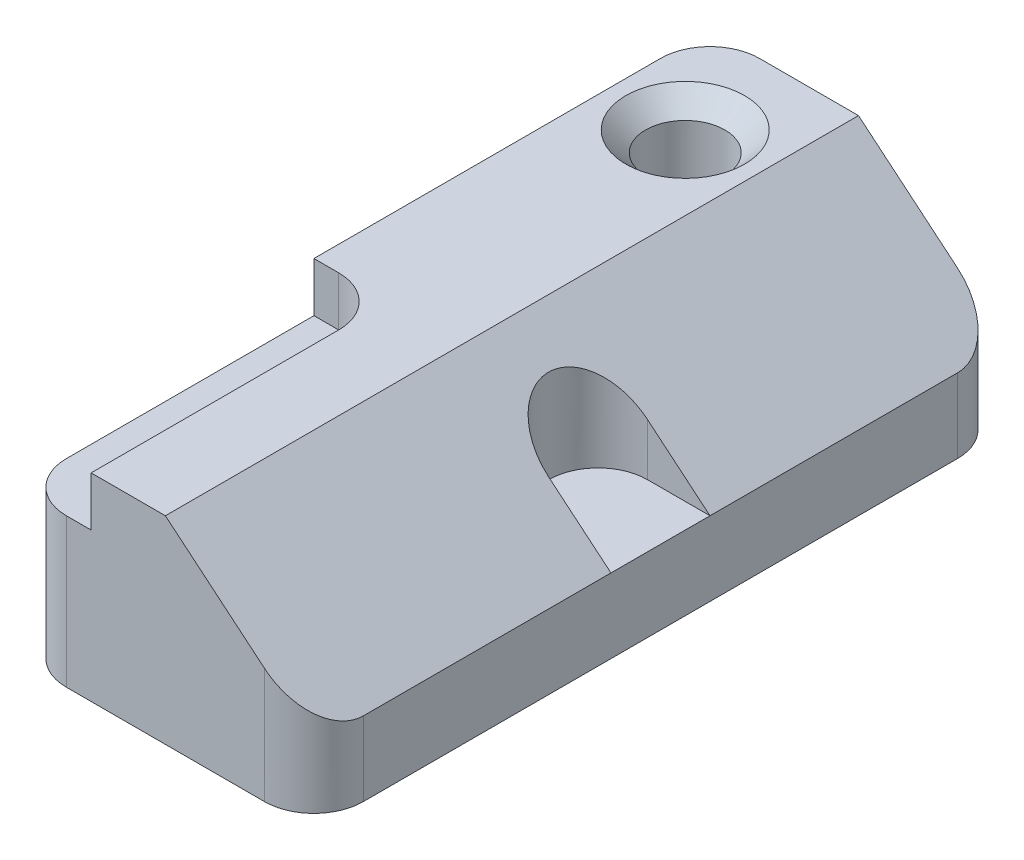
ISO-10303-21;
HEADER;
FILE_DESCRIPTION(('STEP AP214'),'2;1');
FILE_NAME('part.step','',(''),(''),'','','');
FILE_SCHEMA(('AUTOMOTIVE_DESIGN { 1 0 10303 214 1 1 1 1 }'));
ENDSEC;
DATA;
#1=APPLICATION_CONTEXT('core data for automotive mechanical design processes');
#2=APPLICATION_PROTOCOL_DEFINITION('international standard','automotive_design',2000,#1);
#3=PRODUCT_CONTEXT('',#1,'mechanical');
#4=PRODUCT('Part','Part','',(#3));
#5=PRODUCT_RELATED_PRODUCT_CATEGORY('part','',(#4));
#6=PRODUCT_DEFINITION_FORMATION('','',#4);
#7=PRODUCT_DEFINITION_CONTEXT('part definition',#1,'design');
#8=PRODUCT_DEFINITION('design','',#6,#7);
#9=PRODUCT_DEFINITION_SHAPE('','',#8);
#10=(LENGTH_UNIT() NAMED_UNIT(*) SI_UNIT(.MILLI.,.METRE.));
#11=(NAMED_UNIT(*) PLANE_ANGLE_UNIT() SI_UNIT($,.RADIAN.));
#12=(NAMED_UNIT(*) SI_UNIT($,.STERADIAN.) SOLID_ANGLE_UNIT());
#13=UNCERTAINTY_MEASURE_WITH_UNIT(LENGTH_MEASURE(1.E-05),#10,'distance_accuracy_value','');
#14=(GEOMETRIC_REPRESENTATION_CONTEXT(3) GLOBAL_UNCERTAINTY_ASSIGNED_CONTEXT((#13)) GLOBAL_UNIT_ASSIGNED_CONTEXT((#10,
#11,#12)) REPRESENTATION_CONTEXT('',''));
#15=CARTESIAN_POINT('',(0.,0.,0.));
#16=DIRECTION('',(0.,0.,1.));
#17=DIRECTION('',(1.,0.,0.));
#18=AXIS2_PLACEMENT_3D('',#15,#16,#17);
#19=CARTESIAN_POINT('',(0.,50.8,177.8));
#20=DIRECTION('',(0.,-1.,0.));
#21=DIRECTION('',(0.,0.,-1.));
#22=AXIS2_PLACEMENT_3D('',#19,#20,#21);
#23=PLANE('',#22);
#24=CARTESIAN_POINT('',(19.05,50.8,25.4));
#25=DIRECTION('',(0.,-1.,0.));
#26=DIRECTION('',(0.,0.,-1.));
#27=AXIS2_PLACEMENT_3D('',#24,#25,#26);
#28=CIRCLE('',#27,15.24);
#29=CARTESIAN_POINT('',(19.05,50.8,10.16));
#30=VERTEX_POINT('',#29);
#31=EDGE_CURVE('E266',#30,#30,#28,.T.);
#32=ORIENTED_EDGE('',*,*,#31,.T.);
#33=EDGE_LOOP('',(#32));
#34=FACE_BOUND('',#33,.T.);
#35=DIRECTION('',(-1.,0.,0.));
#36=VECTOR('',#35,1.);
#37=CARTESIAN_POINT('',(0.,50.8,0.));
#38=LINE('',#37,#36);
#39=CARTESIAN_POINT('',(38.1,50.8,0.));
#40=VERTEX_POINT('',#39);
#41=CARTESIAN_POINT('',(12.7,50.8,0.));
#42=VERTEX_POINT('',#41);
#43=EDGE_CURVE('E226',#40,#42,#38,.T.);
#44=ORIENTED_EDGE('',*,*,#43,.T.);
#45=CARTESIAN_POINT('',(12.7,50.8,12.7));
#46=DIRECTION('',(0.,-1.,0.));
#47=DIRECTION('',(0.,0.,-1.));
#48=AXIS2_PLACEMENT_3D('',#45,#46,#47);
#49=CIRCLE('',#48,12.7);
#50=CARTESIAN_POINT('',(0.,50.8,12.7));
#51=VERTEX_POINT('',#50);
#52=EDGE_CURVE('E317',#42,#51,#49,.F.);
#53=ORIENTED_EDGE('',*,*,#52,.T.);
#54=DIRECTION('',(0.,0.,-1.));
#55=VECTOR('',#54,1.);
#56=CARTESIAN_POINT('',(0.,50.8,177.8));
#57=LINE('',#56,#55);
#58=CARTESIAN_POINT('',(0.,50.8,101.6));
#59=VERTEX_POINT('',#58);
#60=EDGE_CURVE('E246',#59,#51,#57,.T.);
#61=ORIENTED_EDGE('',*,*,#60,.F.);
#62=DIRECTION('',(1.,0.,0.));
#63=VECTOR('',#62,1.);
#64=CARTESIAN_POINT('',(0.,50.8,101.6));
#65=LINE('',#64,#63);
#66=CARTESIAN_POINT('',(6.35,50.8,101.6));
#67=VERTEX_POINT('',#66);
#68=EDGE_CURVE('E186',#59,#67,#65,.T.);
#69=ORIENTED_EDGE('',*,*,#68,.T.);
#70=CARTESIAN_POINT('',(6.35,50.8,114.3));
#71=DIRECTION('',(0.,-1.,0.));
#72=DIRECTION('',(0.,0.,-1.));
#73=AXIS2_PLACEMENT_3D('',#70,#71,#72);
#74=CIRCLE('',#73,12.7);
#75=CARTESIAN_POINT('',(19.05,50.8,114.3));
#76=VERTEX_POINT('',#75);
#77=EDGE_CURVE('E280',#67,#76,#74,.T.);
#78=ORIENTED_EDGE('',*,*,#77,.T.);
#79=DIRECTION('',(0.,0.,-1.));
#80=VECTOR('',#79,1.);
#81=CARTESIAN_POINT('',(19.05,50.8,177.8));
#82=LINE('',#81,#80);
#83=CARTESIAN_POINT('',(19.05,50.8,177.8));
#84=VERTEX_POINT('',#83);
#85=EDGE_CURVE('E193',#84,#76,#82,.T.);
#86=ORIENTED_EDGE('',*,*,#85,.F.);
#87=DIRECTION('',(-1.,0.,0.));
#88=VECTOR('',#87,1.);
#89=CARTESIAN_POINT('',(0.,50.8,177.8));
#90=LINE('',#89,#88);
#91=CARTESIAN_POINT('',(38.1,50.8,177.8));
#92=VERTEX_POINT('',#91);
#93=EDGE_CURVE('E229',#92,#84,#90,.T.);
#94=ORIENTED_EDGE('',*,*,#93,.F.);
#95=DIRECTION('',(0.,0.,-1.));
#96=VECTOR('',#95,1.);
#97=CARTESIAN_POINT('',(38.1,50.8,177.8));
#98=LINE('',#97,#96);
#99=EDGE_CURVE('E250',#92,#40,#98,.T.);
#100=ORIENTED_EDGE('',*,*,#99,.T.);
#101=EDGE_LOOP('',(#44,#53,#61,#69,#78,#86,#94,#100));
#102=FACE_BOUND('',#101,.T.);
#103=ADVANCED_FACE('F39',(#34,#102),#23,.F.);
#104=CARTESIAN_POINT('',(0.,0.,177.8));
#105=DIRECTION('',(1.,0.,0.));
#106=DIRECTION('',(0.,0.,-1.));
#107=AXIS2_PLACEMENT_3D('',#104,#105,#106);
#108=PLANE('',#107);
#109=ORIENTED_EDGE('',*,*,#60,.T.);
#110=DIRECTION('',(0.,-1.,0.));
#111=VECTOR('',#110,1.);
#112=CARTESIAN_POINT('',(0.,0.,12.7));
#113=LINE('',#112,#111);
#114=CARTESIAN_POINT('',(0.,0.,12.7));
#115=VERTEX_POINT('',#114);
#116=EDGE_CURVE('E295',#51,#115,#113,.T.);
#117=ORIENTED_EDGE('',*,*,#116,.T.);
#118=DIRECTION('',(0.,0.,-1.));
#119=VECTOR('',#118,1.);
#120=CARTESIAN_POINT('',(0.,0.,177.8));
#121=LINE('',#120,#119);
#122=CARTESIAN_POINT('',(0.,0.,165.1));
#123=VERTEX_POINT('',#122);
#124=EDGE_CURVE('E233',#123,#115,#121,.T.);
#125=ORIENTED_EDGE('',*,*,#124,.F.);
#126=DIRECTION('',(0.,-1.,0.));
#127=VECTOR('',#126,1.);
#128=CARTESIAN_POINT('',(0.,0.,165.1));
#129=LINE('',#128,#127);
#130=CARTESIAN_POINT('',(0.,38.1,165.1));
#131=VERTEX_POINT('',#130);
#132=EDGE_CURVE('E292',#123,#131,#129,.F.);
#133=ORIENTED_EDGE('',*,*,#132,.T.);
#134=DIRECTION('',(0.,0.,-1.));
#135=VECTOR('',#134,1.);
#136=CARTESIAN_POINT('',(0.,38.1,177.8));
#137=LINE('',#136,#135);
#138=CARTESIAN_POINT('',(0.,38.1,101.6));
#139=VERTEX_POINT('',#138);
#140=EDGE_CURVE('E200',#131,#139,#137,.T.);
#141=ORIENTED_EDGE('',*,*,#140,.T.);
#142=DIRECTION('',(0.,1.,0.));
#143=VECTOR('',#142,1.);
#144=CARTESIAN_POINT('',(0.,38.1,101.6));
#145=LINE('',#144,#143);
#146=EDGE_CURVE('E203',#139,#59,#145,.T.);
#147=ORIENTED_EDGE('',*,*,#146,.T.);
#148=EDGE_LOOP('',(#109,#117,#125,#133,#141,#147));
#149=FACE_BOUND('',#148,.T.);
#150=ADVANCED_FACE('F370',(#149),#108,.F.);
#151=CARTESIAN_POINT('',(76.2,0.,177.8));
#152=DIRECTION('',(0.,1.,0.));
#153=DIRECTION('',(-1.,0.,0.));
#154=AXIS2_PLACEMENT_3D('',#151,#152,#153);
#155=PLANE('',#154);
#156=CARTESIAN_POINT('',(19.05,0.,25.4));
#157=DIRECTION('',(0.,1.,0.));
#158=DIRECTION('',(0.,0.,1.));
#159=AXIS2_PLACEMENT_3D('',#156,#157,#158);
#160=CIRCLE('',#159,10.16);
#161=CARTESIAN_POINT('',(19.05,0.,35.56));
#162=VERTEX_POINT('',#161);
#163=EDGE_CURVE('E216',#162,#162,#160,.T.);
#164=ORIENTED_EDGE('',*,*,#163,.T.);
#165=EDGE_LOOP('',(#164));
#166=FACE_BOUND('',#165,.T.);
#167=ORIENTED_EDGE('',*,*,#124,.T.);
#168=CARTESIAN_POINT('',(12.7,0.,12.7));
#169=DIRECTION('',(0.,1.,0.));
#170=DIRECTION('',(-1.,0.,0.));
#171=AXIS2_PLACEMENT_3D('',#168,#169,#170);
#172=CIRCLE('',#171,12.7);
#173=CARTESIAN_POINT('',(12.7,0.,0.));
#174=VERTEX_POINT('',#173);
#175=EDGE_CURVE('E308',#115,#174,#172,.F.);
#176=ORIENTED_EDGE('',*,*,#175,.T.);
#177=DIRECTION('',(1.,0.,0.));
#178=VECTOR('',#177,1.);
#179=CARTESIAN_POINT('',(76.2,0.,0.));
#180=LINE('',#179,#178);
#181=CARTESIAN_POINT('',(63.5,0.,0.));
#182=VERTEX_POINT('',#181);
#183=EDGE_CURVE('E220',#174,#182,#180,.T.);
#184=ORIENTED_EDGE('',*,*,#183,.T.);
#185=CARTESIAN_POINT('',(63.5,0.,12.7));
#186=DIRECTION('',(0.,1.,0.));
#187=DIRECTION('',(-1.,0.,0.));
#188=AXIS2_PLACEMENT_3D('',#185,#186,#187);
#189=CIRCLE('',#188,12.7);
#190=CARTESIAN_POINT('',(76.2,0.,12.7));
#191=VERTEX_POINT('',#190);
#192=EDGE_CURVE('E305',#182,#191,#189,.F.);
#193=ORIENTED_EDGE('',*,*,#192,.T.);
#194=DIRECTION('',(0.,0.,-1.));
#195=VECTOR('',#194,1.);
#196=CARTESIAN_POINT('',(76.2,0.,177.8));
#197=LINE('',#196,#195);
#198=CARTESIAN_POINT('',(76.2,0.,165.1));
#199=VERTEX_POINT('',#198);
#200=EDGE_CURVE('E258',#199,#191,#197,.T.);
#201=ORIENTED_EDGE('',*,*,#200,.F.);
#202=CARTESIAN_POINT('',(63.5,0.,165.1));
#203=DIRECTION('',(0.,1.,0.));
#204=DIRECTION('',(-1.,0.,0.));
#205=AXIS2_PLACEMENT_3D('',#202,#203,#204);
#206=CIRCLE('',#205,12.7);
#207=CARTESIAN_POINT('',(63.5,0.,177.8));
#208=VERTEX_POINT('',#207);
#209=EDGE_CURVE('E302',#199,#208,#206,.F.);
#210=ORIENTED_EDGE('',*,*,#209,.T.);
#211=DIRECTION('',(1.,0.,0.));
#212=VECTOR('',#211,1.);
#213=CARTESIAN_POINT('',(76.2,0.,177.8));
#214=LINE('',#213,#212);
#215=CARTESIAN_POINT('',(12.7,0.,177.8));
#216=VERTEX_POINT('',#215);
#217=EDGE_CURVE('E221',#216,#208,#214,.T.);
#218=ORIENTED_EDGE('',*,*,#217,.F.);
#219=CARTESIAN_POINT('',(12.7,0.,165.1));
#220=DIRECTION('',(0.,1.,0.));
#221=DIRECTION('',(-1.,0.,0.));
#222=AXIS2_PLACEMENT_3D('',#219,#220,#221);
#223=CIRCLE('',#222,12.7);
#224=EDGE_CURVE('E299',#216,#123,#223,.F.);
#225=ORIENTED_EDGE('',*,*,#224,.T.);
#226=EDGE_LOOP('',(#167,#176,#184,#193,#201,#210,#218,#225));
#227=FACE_BOUND('',#226,.T.);
#228=ADVANCED_FACE('F377',(#166,#227),#155,.F.);
#229=CARTESIAN_POINT('',(76.2,19.05,177.8));
#230=DIRECTION('',(-1.,0.,0.));
#231=DIRECTION('',(0.,0.,1.));
#232=AXIS2_PLACEMENT_3D('',#229,#230,#231);
#233=PLANE('',#232);
#234=ORIENTED_EDGE('',*,*,#200,.T.);
#235=DIRECTION('',(0.,1.,0.));
#236=VECTOR('',#235,1.);
#237=CARTESIAN_POINT('',(76.2,19.05,12.7));
#238=LINE('',#237,#236);
#239=CARTESIAN_POINT('',(76.2,19.05,12.7));
#240=VERTEX_POINT('',#239);
#241=EDGE_CURVE('E323',#191,#240,#238,.T.);
#242=ORIENTED_EDGE('',*,*,#241,.T.);
#243=DIRECTION('',(0.,0.,-1.));
#244=VECTOR('',#243,1.);
#245=CARTESIAN_POINT('',(76.2,19.05,177.8));
#246=LINE('',#245,#244);
#247=CARTESIAN_POINT('',(76.2,19.05,76.2));
#248=VERTEX_POINT('',#247);
#249=EDGE_CURVE('E254',#248,#240,#246,.T.);
#250=ORIENTED_EDGE('',*,*,#249,.F.);
#251=DIRECTION('',(0.,0.,1.));
#252=VECTOR('',#251,1.);
#253=CARTESIAN_POINT('',(76.2,19.05,76.2));
#254=LINE('',#253,#252);
#255=CARTESIAN_POINT('',(76.2,19.05,101.6));
#256=VERTEX_POINT('',#255);
#257=EDGE_CURVE('E174',#248,#256,#254,.T.);
#258=ORIENTED_EDGE('',*,*,#257,.T.);
#259=CARTESIAN_POINT('',(76.2,19.05,165.1));
#260=VERTEX_POINT('',#259);
#261=EDGE_CURVE('E255',#260,#256,#246,.T.);
#262=ORIENTED_EDGE('',*,*,#261,.F.);
#263=DIRECTION('',(0.,1.,0.));
#264=VECTOR('',#263,1.);
#265=CARTESIAN_POINT('',(76.2,19.05,165.1));
#266=LINE('',#265,#264);
#267=EDGE_CURVE('E320',#260,#199,#266,.F.);
#268=ORIENTED_EDGE('',*,*,#267,.T.);
#269=EDGE_LOOP('',(#234,#242,#250,#258,#262,#268));
#270=FACE_BOUND('',#269,.T.);
#271=ADVANCED_FACE('F387',(#270),#233,.F.);
#272=CARTESIAN_POINT('',(38.1,50.8,177.8));
#273=DIRECTION('',(-0.64018439966448,-0.768221279597376,0.));
#274=DIRECTION('',(0.768221279597376,-0.64018439966448,0.));
#275=AXIS2_PLACEMENT_3D('',#272,#273,#274);
#276=PLANE('',#275);
#277=ORIENTED_EDGE('',*,*,#249,.T.);
#278=CARTESIAN_POINT('',(63.5,29.6333333333333,12.7));
#279=DIRECTION('',(-0.64018439966448,-0.768221279597376,0.));
#280=DIRECTION('',(0.768221279597376,-0.64018439966448,0.));
#281=AXIS2_PLACEMENT_3D('',#278,#279,#280);
#282=ELLIPSE('',#281,16.5316951473358,12.7);
#283=CARTESIAN_POINT('',(63.5,29.6333333333333,0.));
#284=VERTEX_POINT('',#283);
#285=EDGE_CURVE('E329',#240,#284,#282,.F.);
#286=ORIENTED_EDGE('',*,*,#285,.T.);
#287=DIRECTION('',(-0.768221279597376,0.64018439966448,0.));
#288=VECTOR('',#287,1.);
#289=CARTESIAN_POINT('',(38.1,50.8,0.));
#290=LINE('',#289,#288);
#291=EDGE_CURVE('E237',#284,#40,#290,.T.);
#292=ORIENTED_EDGE('',*,*,#291,.T.);
#293=ORIENTED_EDGE('',*,*,#99,.F.);
#294=DIRECTION('',(-0.768221279597376,0.64018439966448,0.));
#295=VECTOR('',#294,1.);
#296=CARTESIAN_POINT('',(38.1,50.8,177.8));
#297=LINE('',#296,#295);
#298=CARTESIAN_POINT('',(63.5,29.6333333333333,177.8));
#299=VERTEX_POINT('',#298);
#300=EDGE_CURVE('E225',#299,#92,#297,.T.);
#301=ORIENTED_EDGE('',*,*,#300,.F.);
#302=CARTESIAN_POINT('',(63.5,29.6333333333333,165.1));
#303=DIRECTION('',(-0.64018439966448,-0.768221279597376,0.));
#304=DIRECTION('',(-0.768221279597376,0.64018439966448,0.));
#305=AXIS2_PLACEMENT_3D('',#302,#303,#304);
#306=ELLIPSE('',#305,16.5316951473358,12.7);
#307=EDGE_CURVE('E61',#299,#260,#306,.F.);
#308=ORIENTED_EDGE('',*,*,#307,.T.);
#309=ORIENTED_EDGE('',*,*,#261,.T.);
#310=DIRECTION('',(0.768221279597376,-0.64018439966448,0.));
#311=VECTOR('',#310,1.);
#312=CARTESIAN_POINT('',(38.1,50.8,101.6));
#313=LINE('',#312,#311);
#314=CARTESIAN_POINT('',(60.198,32.385,101.6));
#315=VERTEX_POINT('',#314);
#316=EDGE_CURVE('E286',#315,#256,#313,.T.);
#317=ORIENTED_EDGE('',*,*,#316,.F.);
#318=CARTESIAN_POINT('',(60.198,32.385,88.9));
#319=DIRECTION('',(-0.64018439966448,-0.768221279597376,0.));
#320=DIRECTION('',(-0.768221279597376,0.64018439966448,0.));
#321=AXIS2_PLACEMENT_3D('',#318,#319,#320);
#322=ELLIPSE('',#321,16.5316951473358,12.7);
#323=CARTESIAN_POINT('',(60.198,32.385,76.2));
#324=VERTEX_POINT('',#323);
#325=EDGE_CURVE('E283',#324,#315,#322,.F.);
#326=ORIENTED_EDGE('',*,*,#325,.F.);
#327=DIRECTION('',(0.768221279597376,-0.64018439966448,0.));
#328=VECTOR('',#327,1.);
#329=CARTESIAN_POINT('',(38.1,50.8,76.2));
#330=LINE('',#329,#328);
#331=EDGE_CURVE('E172',#324,#248,#330,.T.);
#332=ORIENTED_EDGE('',*,*,#331,.T.);
#333=EDGE_LOOP('',(#277,#286,#292,#293,#301,#308,#309,#317,#326,#332));
#334=FACE_BOUND('',#333,.T.);
#335=ADVANCED_FACE('F344',(#334),#276,.F.);
#336=CARTESIAN_POINT('',(0.,0.,177.8));
#337=DIRECTION('',(0.,0.,-1.));
#338=DIRECTION('',(-1.,0.,0.));
#339=AXIS2_PLACEMENT_3D('',#336,#337,#338);
#340=PLANE('',#339);
#341=ORIENTED_EDGE('',*,*,#217,.T.);
#342=DIRECTION('',(0.,1.,0.));
#343=VECTOR('',#342,1.);
#344=CARTESIAN_POINT('',(63.5,0.,177.8));
#345=LINE('',#344,#343);
#346=EDGE_CURVE('E48',#208,#299,#345,.T.);
#347=ORIENTED_EDGE('',*,*,#346,.T.);
#348=ORIENTED_EDGE('',*,*,#300,.T.);
#349=ORIENTED_EDGE('',*,*,#93,.T.);
#350=DIRECTION('',(0.,1.,0.));
#351=VECTOR('',#350,1.);
#352=CARTESIAN_POINT('',(19.05,38.1,177.8));
#353=LINE('',#352,#351);
#354=CARTESIAN_POINT('',(19.05,38.1,177.8));
#355=VERTEX_POINT('',#354);
#356=EDGE_CURVE('E213',#355,#84,#353,.T.);
#357=ORIENTED_EDGE('',*,*,#356,.F.);
#358=DIRECTION('',(1.,0.,0.));
#359=VECTOR('',#358,1.);
#360=CARTESIAN_POINT('',(0.,38.1,177.8));
#361=LINE('',#360,#359);
#362=CARTESIAN_POINT('',(12.7,38.1,177.8));
#363=VERTEX_POINT('',#362);
#364=EDGE_CURVE('E197',#363,#355,#361,.T.);
#365=ORIENTED_EDGE('',*,*,#364,.F.);
#366=DIRECTION('',(0.,-1.,0.));
#367=VECTOR('',#366,1.);
#368=CARTESIAN_POINT('',(12.7,0.,177.8));
#369=LINE('',#368,#367);
#370=EDGE_CURVE('E332',#363,#216,#369,.T.);
#371=ORIENTED_EDGE('',*,*,#370,.T.);
#372=EDGE_LOOP('',(#341,#347,#348,#349,#357,#365,#371));
#373=FACE_BOUND('',#372,.T.);
#374=ADVANCED_FACE('F338',(#373),#340,.F.);
#375=CARTESIAN_POINT('',(0.,0.,0.));
#376=DIRECTION('',(0.,0.,-1.));
#377=DIRECTION('',(-1.,0.,0.));
#378=AXIS2_PLACEMENT_3D('',#375,#376,#377);
#379=PLANE('',#378);
#380=ORIENTED_EDGE('',*,*,#183,.F.);
#381=DIRECTION('',(0.,-1.,0.));
#382=VECTOR('',#381,1.);
#383=CARTESIAN_POINT('',(12.7,50.8,0.));
#384=LINE('',#383,#382);
#385=EDGE_CURVE('E314',#174,#42,#384,.F.);
#386=ORIENTED_EDGE('',*,*,#385,.T.);
#387=ORIENTED_EDGE('',*,*,#43,.F.);
#388=ORIENTED_EDGE('',*,*,#291,.F.);
#389=DIRECTION('',(0.,1.,0.));
#390=VECTOR('',#389,1.);
#391=CARTESIAN_POINT('',(63.5,0.,0.));
#392=LINE('',#391,#390);
#393=EDGE_CURVE('E311',#284,#182,#392,.F.);
#394=ORIENTED_EDGE('',*,*,#393,.T.);
#395=EDGE_LOOP('',(#380,#386,#387,#388,#394));
#396=FACE_BOUND('',#395,.T.);
#397=ADVANCED_FACE('F380',(#396),#379,.T.);
#398=CARTESIAN_POINT('',(19.05,0.,25.4));
#399=DIRECTION('',(0.,1.,0.));
#400=DIRECTION('',(0.,0.,1.));
#401=AXIS2_PLACEMENT_3D('',#398,#399,#400);
#402=CYLINDRICAL_SURFACE('',#401,10.16);
#403=CARTESIAN_POINT('',(19.05,45.7200000000001,25.4));
#404=DIRECTION('',(0.,-1.,0.));
#405=DIRECTION('',(0.,0.,-1.));
#406=AXIS2_PLACEMENT_3D('',#403,#404,#405);
#407=CIRCLE('',#406,10.16);
#408=CARTESIAN_POINT('',(19.05,45.7200000000001,15.24));
#409=VERTEX_POINT('',#408);
#410=EDGE_CURVE('E262',#409,#409,#407,.F.);
#411=ORIENTED_EDGE('',*,*,#410,.T.);
#412=EDGE_LOOP('',(#411));
#413=FACE_BOUND('',#412,.T.);
#414=ORIENTED_EDGE('',*,*,#163,.F.);
#415=EDGE_LOOP('',(#414));
#416=FACE_BOUND('',#415,.T.);
#417=ADVANCED_FACE('F415',(#413,#416),#402,.F.);
#418=CARTESIAN_POINT('',(19.05,45.7200000000001,25.4));
#419=DIRECTION('',(0.,1.,0.));
#420=DIRECTION('',(0.,0.,1.));
#421=AXIS2_PLACEMENT_3D('',#418,#419,#420);
#422=CONICAL_SURFACE('',#421,10.16,0.785398163397452);
#423=ORIENTED_EDGE('',*,*,#31,.F.);
#424=EDGE_LOOP('',(#423));
#425=FACE_BOUND('',#424,.T.);
#426=ORIENTED_EDGE('',*,*,#410,.F.);
#427=EDGE_LOOP('',(#426));
#428=FACE_BOUND('',#427,.T.);
#429=ADVANCED_FACE('F412',(#425,#428),#422,.F.);
#430=CARTESIAN_POINT('',(0.,38.1,101.6));
#431=DIRECTION('',(0.,0.,1.));
#432=DIRECTION('',(1.,0.,0.));
#433=AXIS2_PLACEMENT_3D('',#430,#431,#432);
#434=PLANE('',#433);
#435=DIRECTION('',(1.,0.,0.));
#436=VECTOR('',#435,1.);
#437=CARTESIAN_POINT('',(0.,38.1,101.6));
#438=LINE('',#437,#436);
#439=CARTESIAN_POINT('',(6.35,38.1,101.6));
#440=VERTEX_POINT('',#439);
#441=EDGE_CURVE('E188',#139,#440,#438,.T.);
#442=ORIENTED_EDGE('',*,*,#441,.T.);
#443=DIRECTION('',(0.,1.,0.));
#444=VECTOR('',#443,1.);
#445=CARTESIAN_POINT('',(6.35,38.1,101.6));
#446=LINE('',#445,#444);
#447=EDGE_CURVE('E270',#440,#67,#446,.T.);
#448=ORIENTED_EDGE('',*,*,#447,.T.);
#449=ORIENTED_EDGE('',*,*,#68,.F.);
#450=ORIENTED_EDGE('',*,*,#146,.F.);
#451=EDGE_LOOP('',(#442,#448,#449,#450));
#452=FACE_BOUND('',#451,.T.);
#453=ADVANCED_FACE('F364',(#452),#434,.T.);
#454=CARTESIAN_POINT('',(19.05,38.1,177.8));
#455=DIRECTION('',(1.,0.,0.));
#456=DIRECTION('',(0.,0.,-1.));
#457=AXIS2_PLACEMENT_3D('',#454,#455,#456);
#458=PLANE('',#457);
#459=ORIENTED_EDGE('',*,*,#85,.T.);
#460=DIRECTION('',(0.,1.,0.));
#461=VECTOR('',#460,1.);
#462=CARTESIAN_POINT('',(19.05,38.1,114.3));
#463=LINE('',#462,#461);
#464=CARTESIAN_POINT('',(19.05,38.1,114.3));
#465=VERTEX_POINT('',#464);
#466=EDGE_CURVE('E274',#76,#465,#463,.F.);
#467=ORIENTED_EDGE('',*,*,#466,.T.);
#468=DIRECTION('',(0.,0.,-1.));
#469=VECTOR('',#468,1.);
#470=CARTESIAN_POINT('',(19.05,38.1,177.8));
#471=LINE('',#470,#469);
#472=EDGE_CURVE('E192',#355,#465,#471,.T.);
#473=ORIENTED_EDGE('',*,*,#472,.F.);
#474=ORIENTED_EDGE('',*,*,#356,.T.);
#475=EDGE_LOOP('',(#459,#467,#473,#474));
#476=FACE_BOUND('',#475,.T.);
#477=ADVANCED_FACE('F355',(#476),#458,.F.);
#478=CARTESIAN_POINT('',(0.,38.1,0.));
#479=DIRECTION('',(0.,1.,0.));
#480=DIRECTION('',(0.,0.,1.));
#481=AXIS2_PLACEMENT_3D('',#478,#479,#480);
#482=PLANE('',#481);
#483=ORIENTED_EDGE('',*,*,#140,.F.);
#484=CARTESIAN_POINT('',(12.7,38.1,165.1));
#485=DIRECTION('',(0.,1.,0.));
#486=DIRECTION('',(0.,0.,1.));
#487=AXIS2_PLACEMENT_3D('',#484,#485,#486);
#488=CIRCLE('',#487,12.7);
#489=EDGE_CURVE('E11',#131,#363,#488,.T.);
#490=ORIENTED_EDGE('',*,*,#489,.T.);
#491=ORIENTED_EDGE('',*,*,#364,.T.);
#492=ORIENTED_EDGE('',*,*,#472,.T.);
#493=CARTESIAN_POINT('',(6.35,38.1,114.3));
#494=DIRECTION('',(0.,1.,0.));
#495=DIRECTION('',(0.,0.,1.));
#496=AXIS2_PLACEMENT_3D('',#493,#494,#495);
#497=CIRCLE('',#496,12.7);
#498=EDGE_CURVE('E277',#465,#440,#497,.T.);
#499=ORIENTED_EDGE('',*,*,#498,.T.);
#500=ORIENTED_EDGE('',*,*,#441,.F.);
#501=EDGE_LOOP('',(#483,#490,#491,#492,#499,#500));
#502=FACE_BOUND('',#501,.T.);
#503=ADVANCED_FACE('F358',(#502),#482,.T.);
#504=CARTESIAN_POINT('',(6.35,38.1,114.3));
#505=DIRECTION('',(0.,1.,0.));
#506=DIRECTION('',(0.,0.,1.));
#507=AXIS2_PLACEMENT_3D('',#504,#505,#506);
#508=CYLINDRICAL_SURFACE('',#507,12.7);
#509=ORIENTED_EDGE('',*,*,#498,.F.);
#510=ORIENTED_EDGE('',*,*,#466,.F.);
#511=ORIENTED_EDGE('',*,*,#77,.F.);
#512=ORIENTED_EDGE('',*,*,#447,.F.);
#513=EDGE_LOOP('',(#509,#510,#511,#512));
#514=FACE_BOUND('',#513,.T.);
#515=ADVANCED_FACE('F362',(#514),#508,.F.);
#516=CARTESIAN_POINT('',(76.2,19.05,76.2));
#517=DIRECTION('',(0.,0.,-1.));
#518=DIRECTION('',(-1.,0.,0.));
#519=AXIS2_PLACEMENT_3D('',#516,#517,#518);
#520=PLANE('',#519);
#521=DIRECTION('',(0.,1.,0.));
#522=VECTOR('',#521,1.);
#523=CARTESIAN_POINT('',(60.198,19.05,76.2));
#524=LINE('',#523,#522);
#525=CARTESIAN_POINT('',(60.198,19.05,76.2));
#526=VERTEX_POINT('',#525);
#527=EDGE_CURVE('E157',#526,#324,#524,.T.);
#528=ORIENTED_EDGE('',*,*,#527,.F.);
#529=DIRECTION('',(-1.,0.,0.));
#530=VECTOR('',#529,1.);
#531=CARTESIAN_POINT('',(76.2,19.05,76.2));
#532=LINE('',#531,#530);
#533=EDGE_CURVE('E166',#248,#526,#532,.T.);
#534=ORIENTED_EDGE('',*,*,#533,.F.);
#535=ORIENTED_EDGE('',*,*,#331,.F.);
#536=EDGE_LOOP('',(#528,#534,#535));
#537=FACE_BOUND('',#536,.T.);
#538=ADVANCED_FACE('F170',(#537),#520,.F.);
#539=CARTESIAN_POINT('',(76.2,19.05,101.6));
#540=DIRECTION('',(0.,0.,-1.));
#541=DIRECTION('',(-1.,0.,0.));
#542=AXIS2_PLACEMENT_3D('',#539,#540,#541);
#543=PLANE('',#542);
#544=ORIENTED_EDGE('',*,*,#316,.T.);
#545=DIRECTION('',(-1.,0.,0.));
#546=VECTOR('',#545,1.);
#547=CARTESIAN_POINT('',(76.2,19.05,101.6));
#548=LINE('',#547,#546);
#549=CARTESIAN_POINT('',(60.198,19.05,101.6));
#550=VERTEX_POINT('',#549);
#551=EDGE_CURVE('E165',#256,#550,#548,.T.);
#552=ORIENTED_EDGE('',*,*,#551,.T.);
#553=DIRECTION('',(0.,1.,0.));
#554=VECTOR('',#553,1.);
#555=CARTESIAN_POINT('',(60.198,19.05,101.6));
#556=LINE('',#555,#554);
#557=EDGE_CURVE('E160',#550,#315,#556,.T.);
#558=ORIENTED_EDGE('',*,*,#557,.T.);
#559=EDGE_LOOP('',(#544,#552,#558));
#560=FACE_BOUND('',#559,.T.);
#561=ADVANCED_FACE('F458',(#560),#543,.T.);
#562=CARTESIAN_POINT('',(60.198,19.05,88.9));
#563=DIRECTION('',(0.,1.,0.));
#564=DIRECTION('',(0.,0.,1.));
#565=AXIS2_PLACEMENT_3D('',#562,#563,#564);
#566=CYLINDRICAL_SURFACE('',#565,12.7);
#567=ORIENTED_EDGE('',*,*,#325,.T.);
#568=ORIENTED_EDGE('',*,*,#557,.F.);
#569=CARTESIAN_POINT('',(60.198,19.05,88.9));
#570=DIRECTION('',(0.,-1.,0.));
#571=DIRECTION('',(0.,0.,-1.));
#572=AXIS2_PLACEMENT_3D('',#569,#570,#571);
#573=CIRCLE('',#572,12.7);
#574=EDGE_CURVE('E154',#550,#526,#573,.T.);
#575=ORIENTED_EDGE('',*,*,#574,.T.);
#576=ORIENTED_EDGE('',*,*,#527,.T.);
#577=EDGE_LOOP('',(#567,#568,#575,#576));
#578=FACE_BOUND('',#577,.T.);
#579=ADVANCED_FACE('F156',(#578),#566,.F.);
#580=CARTESIAN_POINT('',(60.198,19.05,88.9));
#581=DIRECTION('',(0.,-1.,0.));
#582=DIRECTION('',(0.,0.,-1.));
#583=AXIS2_PLACEMENT_3D('',#580,#581,#582);
#584=PLANE('',#583);
#585=ORIENTED_EDGE('',*,*,#533,.T.);
#586=ORIENTED_EDGE('',*,*,#574,.F.);
#587=ORIENTED_EDGE('',*,*,#551,.F.);
#588=ORIENTED_EDGE('',*,*,#257,.F.);
#589=EDGE_LOOP('',(#585,#586,#587,#588));
#590=FACE_BOUND('',#589,.T.);
#591=ADVANCED_FACE('F176',(#590),#584,.F.);
#592=CARTESIAN_POINT('',(12.7,0.,12.7));
#593=DIRECTION('',(0.,1.,0.));
#594=DIRECTION('',(0.,0.,1.));
#595=AXIS2_PLACEMENT_3D('',#592,#593,#594);
#596=CYLINDRICAL_SURFACE('',#595,12.7);
#597=ORIENTED_EDGE('',*,*,#52,.F.);
#598=ORIENTED_EDGE('',*,*,#385,.F.);
#599=ORIENTED_EDGE('',*,*,#175,.F.);
#600=ORIENTED_EDGE('',*,*,#116,.F.);
#601=EDGE_LOOP('',(#597,#598,#599,#600));
#602=FACE_BOUND('',#601,.T.);
#603=ADVANCED_FACE('F373',(#602),#596,.T.);
#604=CARTESIAN_POINT('',(63.5,19.05,12.7));
#605=DIRECTION('',(0.,-1.,0.));
#606=DIRECTION('',(0.,0.,-1.));
#607=AXIS2_PLACEMENT_3D('',#604,#605,#606);
#608=CYLINDRICAL_SURFACE('',#607,12.7);
#609=ORIENTED_EDGE('',*,*,#192,.F.);
#610=ORIENTED_EDGE('',*,*,#393,.F.);
#611=ORIENTED_EDGE('',*,*,#285,.F.);
#612=ORIENTED_EDGE('',*,*,#241,.F.);
#613=EDGE_LOOP('',(#609,#610,#611,#612));
#614=FACE_BOUND('',#613,.T.);
#615=ADVANCED_FACE('F383',(#614),#608,.T.);
#616=CARTESIAN_POINT('',(63.5,0.,165.1));
#617=DIRECTION('',(0.,1.,0.));
#618=DIRECTION('',(0.,0.,1.));
#619=AXIS2_PLACEMENT_3D('',#616,#617,#618);
#620=CYLINDRICAL_SURFACE('',#619,12.7);
#621=ORIENTED_EDGE('',*,*,#209,.F.);
#622=ORIENTED_EDGE('',*,*,#267,.F.);
#623=ORIENTED_EDGE('',*,*,#307,.F.);
#624=ORIENTED_EDGE('',*,*,#346,.F.);
#625=EDGE_LOOP('',(#621,#622,#623,#624));
#626=FACE_BOUND('',#625,.T.);
#627=ADVANCED_FACE('F389',(#626),#620,.T.);
#628=CARTESIAN_POINT('',(12.7,0.,165.1));
#629=DIRECTION('',(0.,-1.,0.));
#630=DIRECTION('',(0.,0.,-1.));
#631=AXIS2_PLACEMENT_3D('',#628,#629,#630);
#632=CYLINDRICAL_SURFACE('',#631,12.7);
#633=ORIENTED_EDGE('',*,*,#489,.F.);
#634=ORIENTED_EDGE('',*,*,#132,.F.);
#635=ORIENTED_EDGE('',*,*,#224,.F.);
#636=ORIENTED_EDGE('',*,*,#370,.F.);
#637=EDGE_LOOP('',(#633,#634,#635,#636));
#638=FACE_BOUND('',#637,.T.);
#639=ADVANCED_FACE('F41',(#638),#632,.T.);
#640=CLOSED_SHELL('',(#103,#150,#228,#271,#335,#374,#397,#417,#429,#453,#477,#503,#515,#538,
#561,#579,#591,#603,#615,#627,#639));
#641=MANIFOLD_SOLID_BREP('B2',#640);
#642=ADVANCED_BREP_SHAPE_REPRESENTATION('',(#18,#641),#14);
#643=SHAPE_DEFINITION_REPRESENTATION(#9,#642);
ENDSEC;
END-ISO-10303-21;
